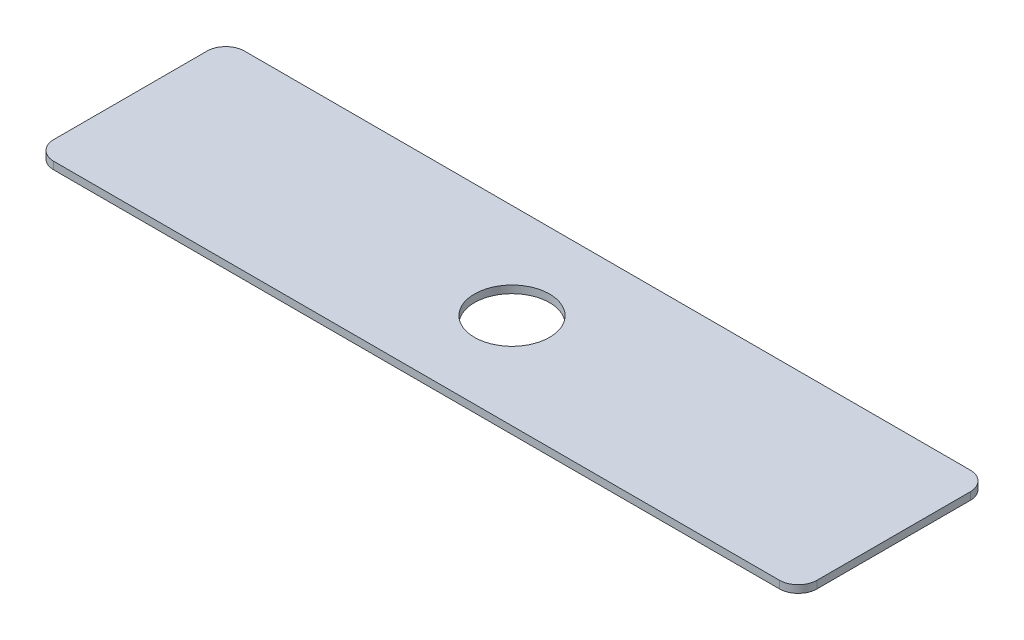
ISO-10303-21;
HEADER;
FILE_DESCRIPTION(('STEP AP214'),'2;1');
FILE_NAME('part.step','',(''),(''),'','','');
FILE_SCHEMA(('AUTOMOTIVE_DESIGN { 1 0 10303 214 1 1 1 1 }'));
ENDSEC;
DATA;
#1=APPLICATION_CONTEXT('core data for automotive mechanical design processes');
#2=APPLICATION_PROTOCOL_DEFINITION('international standard','automotive_design',2000,#1);
#3=PRODUCT_CONTEXT('',#1,'mechanical');
#4=PRODUCT('Part','Part','',(#3));
#5=PRODUCT_RELATED_PRODUCT_CATEGORY('part','',(#4));
#6=PRODUCT_DEFINITION_FORMATION('','',#4);
#7=PRODUCT_DEFINITION_CONTEXT('part definition',#1,'design');
#8=PRODUCT_DEFINITION('design','',#6,#7);
#9=PRODUCT_DEFINITION_SHAPE('','',#8);
#10=(LENGTH_UNIT() NAMED_UNIT(*) SI_UNIT(.MILLI.,.METRE.));
#11=(NAMED_UNIT(*) PLANE_ANGLE_UNIT() SI_UNIT($,.RADIAN.));
#12=(NAMED_UNIT(*) SI_UNIT($,.STERADIAN.) SOLID_ANGLE_UNIT());
#13=UNCERTAINTY_MEASURE_WITH_UNIT(LENGTH_MEASURE(1.E-05),#10,'distance_accuracy_value','');
#14=(GEOMETRIC_REPRESENTATION_CONTEXT(3) GLOBAL_UNCERTAINTY_ASSIGNED_CONTEXT((#13)) GLOBAL_UNIT_ASSIGNED_CONTEXT((#10,
#11,#12)) REPRESENTATION_CONTEXT('',''));
#15=CARTESIAN_POINT('',(0.,0.,0.));
#16=DIRECTION('',(0.,0.,1.));
#17=DIRECTION('',(1.,0.,0.));
#18=AXIS2_PLACEMENT_3D('',#15,#16,#17);
#19=CARTESIAN_POINT('',(101.6,1.,-25.4));
#20=DIRECTION('',(-1.,0.,0.));
#21=DIRECTION('',(0.,0.,1.));
#22=AXIS2_PLACEMENT_3D('',#19,#20,#21);
#23=PLANE('',#22);
#24=DIRECTION('',(0.,0.,-1.));
#25=VECTOR('',#24,1.);
#26=CARTESIAN_POINT('',(101.6,-1.,-25.4));
#27=LINE('',#26,#25);
#28=CARTESIAN_POINT('',(101.6,-1.,20.4));
#29=VERTEX_POINT('',#28);
#30=CARTESIAN_POINT('',(101.6,-1.,-20.4));
#31=VERTEX_POINT('',#30);
#32=EDGE_CURVE('E157',#29,#31,#27,.T.);
#33=ORIENTED_EDGE('',*,*,#32,.T.);
#34=DIRECTION('',(0.,-1.,0.));
#35=VECTOR('',#34,1.);
#36=CARTESIAN_POINT('',(101.6,1.,-20.4));
#37=LINE('',#36,#35);
#38=CARTESIAN_POINT('',(101.6,1.,-20.4));
#39=VERTEX_POINT('',#38);
#40=EDGE_CURVE('E11',#31,#39,#37,.F.);
#41=ORIENTED_EDGE('',*,*,#40,.T.);
#42=DIRECTION('',(0.,0.,-1.));
#43=VECTOR('',#42,1.);
#44=CARTESIAN_POINT('',(101.6,1.,-25.4));
#45=LINE('',#44,#43);
#46=CARTESIAN_POINT('',(101.6,1.,20.4));
#47=VERTEX_POINT('',#46);
#48=EDGE_CURVE('E125',#47,#39,#45,.T.);
#49=ORIENTED_EDGE('',*,*,#48,.F.);
#50=DIRECTION('',(0.,-1.,0.));
#51=VECTOR('',#50,1.);
#52=CARTESIAN_POINT('',(101.6,1.,20.4));
#53=LINE('',#52,#51);
#54=EDGE_CURVE('E41',#47,#29,#53,.T.);
#55=ORIENTED_EDGE('',*,*,#54,.T.);
#56=EDGE_LOOP('',(#33,#41,#49,#55));
#57=FACE_BOUND('',#56,.T.);
#58=ADVANCED_FACE('F33',(#57),#23,.F.);
#59=CARTESIAN_POINT('',(-101.6,1.,-25.4));
#60=DIRECTION('',(0.,0.,1.));
#61=DIRECTION('',(1.,0.,0.));
#62=AXIS2_PLACEMENT_3D('',#59,#60,#61);
#63=PLANE('',#62);
#64=DIRECTION('',(-1.,0.,0.));
#65=VECTOR('',#64,1.);
#66=CARTESIAN_POINT('',(-101.6,-1.,-25.4));
#67=LINE('',#66,#65);
#68=CARTESIAN_POINT('',(96.6,-1.,-25.4));
#69=VERTEX_POINT('',#68);
#70=CARTESIAN_POINT('',(-96.6,-1.,-25.4));
#71=VERTEX_POINT('',#70);
#72=EDGE_CURVE('E130',#69,#71,#67,.T.);
#73=ORIENTED_EDGE('',*,*,#72,.T.);
#74=DIRECTION('',(0.,-1.,0.));
#75=VECTOR('',#74,1.);
#76=CARTESIAN_POINT('',(-96.6,1.,-25.4));
#77=LINE('',#76,#75);
#78=CARTESIAN_POINT('',(-96.6,1.,-25.4));
#79=VERTEX_POINT('',#78);
#80=EDGE_CURVE('E48',#71,#79,#77,.F.);
#81=ORIENTED_EDGE('',*,*,#80,.T.);
#82=DIRECTION('',(-1.,0.,0.));
#83=VECTOR('',#82,1.);
#84=CARTESIAN_POINT('',(-101.6,1.,-25.4));
#85=LINE('',#84,#83);
#86=CARTESIAN_POINT('',(96.6,1.,-25.4));
#87=VERTEX_POINT('',#86);
#88=EDGE_CURVE('E128',#87,#79,#85,.T.);
#89=ORIENTED_EDGE('',*,*,#88,.F.);
#90=DIRECTION('',(0.,-1.,0.));
#91=VECTOR('',#90,1.);
#92=CARTESIAN_POINT('',(96.6,1.,-25.4));
#93=LINE('',#92,#91);
#94=EDGE_CURVE('E149',#87,#69,#93,.T.);
#95=ORIENTED_EDGE('',*,*,#94,.T.);
#96=EDGE_LOOP('',(#73,#81,#89,#95));
#97=FACE_BOUND('',#96,.T.);
#98=ADVANCED_FACE('F188',(#97),#63,.F.);
#99=CARTESIAN_POINT('',(-101.6,1.,-25.4));
#100=DIRECTION('',(1.,0.,0.));
#101=DIRECTION('',(0.,0.,-1.));
#102=AXIS2_PLACEMENT_3D('',#99,#100,#101);
#103=PLANE('',#102);
#104=DIRECTION('',(0.,0.,1.));
#105=VECTOR('',#104,1.);
#106=CARTESIAN_POINT('',(-101.6,-1.,-25.4));
#107=LINE('',#106,#105);
#108=CARTESIAN_POINT('',(-101.6,-1.,-20.4));
#109=VERTEX_POINT('',#108);
#110=CARTESIAN_POINT('',(-101.6,-1.,20.4));
#111=VERTEX_POINT('',#110);
#112=EDGE_CURVE('E126',#109,#111,#107,.T.);
#113=ORIENTED_EDGE('',*,*,#112,.T.);
#114=DIRECTION('',(0.,-1.,0.));
#115=VECTOR('',#114,1.);
#116=CARTESIAN_POINT('',(-101.6,1.,20.4));
#117=LINE('',#116,#115);
#118=CARTESIAN_POINT('',(-101.6,1.,20.4));
#119=VERTEX_POINT('',#118);
#120=EDGE_CURVE('E104',#111,#119,#117,.F.);
#121=ORIENTED_EDGE('',*,*,#120,.T.);
#122=DIRECTION('',(0.,0.,1.));
#123=VECTOR('',#122,1.);
#124=CARTESIAN_POINT('',(-101.6,1.,-25.4));
#125=LINE('',#124,#123);
#126=CARTESIAN_POINT('',(-101.6,1.,-20.4));
#127=VERTEX_POINT('',#126);
#128=EDGE_CURVE('E169',#127,#119,#125,.T.);
#129=ORIENTED_EDGE('',*,*,#128,.F.);
#130=DIRECTION('',(0.,-1.,0.));
#131=VECTOR('',#130,1.);
#132=CARTESIAN_POINT('',(-101.6,1.,-20.4));
#133=LINE('',#132,#131);
#134=EDGE_CURVE('E109',#127,#109,#133,.T.);
#135=ORIENTED_EDGE('',*,*,#134,.T.);
#136=EDGE_LOOP('',(#113,#121,#129,#135));
#137=FACE_BOUND('',#136,.T.);
#138=ADVANCED_FACE('F185',(#137),#103,.F.);
#139=CARTESIAN_POINT('',(-101.6,1.,25.4));
#140=DIRECTION('',(0.,0.,-1.));
#141=DIRECTION('',(-1.,0.,0.));
#142=AXIS2_PLACEMENT_3D('',#139,#140,#141);
#143=PLANE('',#142);
#144=DIRECTION('',(1.,0.,0.));
#145=VECTOR('',#144,1.);
#146=CARTESIAN_POINT('',(-101.6,1.,25.4));
#147=LINE('',#146,#145);
#148=CARTESIAN_POINT('',(-96.6,1.,25.4));
#149=VERTEX_POINT('',#148);
#150=CARTESIAN_POINT('',(96.6,1.,25.4));
#151=VERTEX_POINT('',#150);
#152=EDGE_CURVE('E119',#149,#151,#147,.T.);
#153=ORIENTED_EDGE('',*,*,#152,.F.);
#154=DIRECTION('',(0.,-1.,0.));
#155=VECTOR('',#154,1.);
#156=CARTESIAN_POINT('',(-96.6,1.,25.4));
#157=LINE('',#156,#155);
#158=CARTESIAN_POINT('',(-96.6,-1.,25.4));
#159=VERTEX_POINT('',#158);
#160=EDGE_CURVE('E103',#149,#159,#157,.T.);
#161=ORIENTED_EDGE('',*,*,#160,.T.);
#162=DIRECTION('',(1.,0.,0.));
#163=VECTOR('',#162,1.);
#164=CARTESIAN_POINT('',(-101.6,-1.,25.4));
#165=LINE('',#164,#163);
#166=CARTESIAN_POINT('',(96.6,-1.,25.4));
#167=VERTEX_POINT('',#166);
#168=EDGE_CURVE('E116',#159,#167,#165,.T.);
#169=ORIENTED_EDGE('',*,*,#168,.T.);
#170=DIRECTION('',(0.,-1.,0.));
#171=VECTOR('',#170,1.);
#172=CARTESIAN_POINT('',(96.6,1.,25.4));
#173=LINE('',#172,#171);
#174=EDGE_CURVE('E121',#167,#151,#173,.F.);
#175=ORIENTED_EDGE('',*,*,#174,.T.);
#176=EDGE_LOOP('',(#153,#161,#169,#175));
#177=FACE_BOUND('',#176,.T.);
#178=ADVANCED_FACE('F115',(#177),#143,.F.);
#179=CARTESIAN_POINT('',(0.,1.,0.));
#180=DIRECTION('',(0.,1.,0.));
#181=DIRECTION('',(0.,0.,1.));
#182=AXIS2_PLACEMENT_3D('',#179,#180,#181);
#183=PLANE('',#182);
#184=CARTESIAN_POINT('',(0.,1.,0.));
#185=DIRECTION('',(0.,1.,0.));
#186=DIRECTION('',(0.,0.,1.));
#187=AXIS2_PLACEMENT_3D('',#184,#185,#186);
#188=CIRCLE('',#187,10.);
#189=CARTESIAN_POINT('',(0.,1.,10.));
#190=VERTEX_POINT('',#189);
#191=EDGE_CURVE('E165',#190,#190,#188,.T.);
#192=ORIENTED_EDGE('',*,*,#191,.F.);
#193=EDGE_LOOP('',(#192));
#194=FACE_BOUND('',#193,.T.);
#195=ORIENTED_EDGE('',*,*,#128,.T.);
#196=CARTESIAN_POINT('',(-96.6,1.,20.4));
#197=DIRECTION('',(0.,1.,0.));
#198=DIRECTION('',(0.,0.,1.));
#199=AXIS2_PLACEMENT_3D('',#196,#197,#198);
#200=CIRCLE('',#199,5.);
#201=EDGE_CURVE('E147',#119,#149,#200,.T.);
#202=ORIENTED_EDGE('',*,*,#201,.T.);
#203=ORIENTED_EDGE('',*,*,#152,.T.);
#204=CARTESIAN_POINT('',(96.6,1.,20.4));
#205=DIRECTION('',(0.,1.,0.));
#206=DIRECTION('',(0.,0.,1.));
#207=AXIS2_PLACEMENT_3D('',#204,#205,#206);
#208=CIRCLE('',#207,5.);
#209=EDGE_CURVE('E142',#151,#47,#208,.T.);
#210=ORIENTED_EDGE('',*,*,#209,.T.);
#211=ORIENTED_EDGE('',*,*,#48,.T.);
#212=CARTESIAN_POINT('',(96.6,1.,-20.4));
#213=DIRECTION('',(0.,1.,0.));
#214=DIRECTION('',(0.,0.,1.));
#215=AXIS2_PLACEMENT_3D('',#212,#213,#214);
#216=CIRCLE('',#215,5.);
#217=EDGE_CURVE('E55',#39,#87,#216,.T.);
#218=ORIENTED_EDGE('',*,*,#217,.T.);
#219=ORIENTED_EDGE('',*,*,#88,.T.);
#220=CARTESIAN_POINT('',(-96.6,1.,-20.4));
#221=DIRECTION('',(0.,1.,0.));
#222=DIRECTION('',(0.,0.,1.));
#223=AXIS2_PLACEMENT_3D('',#220,#221,#222);
#224=CIRCLE('',#223,5.);
#225=EDGE_CURVE('E145',#79,#127,#224,.T.);
#226=ORIENTED_EDGE('',*,*,#225,.T.);
#227=EDGE_LOOP('',(#195,#202,#203,#210,#211,#218,#219,#226));
#228=FACE_BOUND('',#227,.T.);
#229=ADVANCED_FACE('F178',(#194,#228),#183,.T.);
#230=CARTESIAN_POINT('',(0.,-1.,0.));
#231=DIRECTION('',(0.,1.,0.));
#232=DIRECTION('',(0.,0.,1.));
#233=AXIS2_PLACEMENT_3D('',#230,#231,#232);
#234=PLANE('',#233);
#235=CARTESIAN_POINT('',(0.,-1.,0.));
#236=DIRECTION('',(0.,1.,0.));
#237=DIRECTION('',(0.,0.,1.));
#238=AXIS2_PLACEMENT_3D('',#235,#236,#237);
#239=CIRCLE('',#238,10.);
#240=CARTESIAN_POINT('',(0.,-1.,10.));
#241=VERTEX_POINT('',#240);
#242=EDGE_CURVE('E162',#241,#241,#239,.T.);
#243=ORIENTED_EDGE('',*,*,#242,.T.);
#244=EDGE_LOOP('',(#243));
#245=FACE_BOUND('',#244,.T.);
#246=ORIENTED_EDGE('',*,*,#168,.F.);
#247=CARTESIAN_POINT('',(-96.6,-1.,20.4));
#248=DIRECTION('',(0.,1.,0.));
#249=DIRECTION('',(0.,0.,1.));
#250=AXIS2_PLACEMENT_3D('',#247,#248,#249);
#251=CIRCLE('',#250,5.);
#252=EDGE_CURVE('E99',#159,#111,#251,.F.);
#253=ORIENTED_EDGE('',*,*,#252,.T.);
#254=ORIENTED_EDGE('',*,*,#112,.F.);
#255=CARTESIAN_POINT('',(-96.6,-1.,-20.4));
#256=DIRECTION('',(0.,1.,0.));
#257=DIRECTION('',(0.,0.,1.));
#258=AXIS2_PLACEMENT_3D('',#255,#256,#257);
#259=CIRCLE('',#258,5.);
#260=EDGE_CURVE('E110',#109,#71,#259,.F.);
#261=ORIENTED_EDGE('',*,*,#260,.T.);
#262=ORIENTED_EDGE('',*,*,#72,.F.);
#263=CARTESIAN_POINT('',(96.6,-1.,-20.4));
#264=DIRECTION('',(0.,1.,0.));
#265=DIRECTION('',(0.,0.,1.));
#266=AXIS2_PLACEMENT_3D('',#263,#264,#265);
#267=CIRCLE('',#266,5.);
#268=EDGE_CURVE('E136',#69,#31,#267,.F.);
#269=ORIENTED_EDGE('',*,*,#268,.T.);
#270=ORIENTED_EDGE('',*,*,#32,.F.);
#271=CARTESIAN_POINT('',(96.6,-1.,20.4));
#272=DIRECTION('',(0.,1.,0.));
#273=DIRECTION('',(0.,0.,1.));
#274=AXIS2_PLACEMENT_3D('',#271,#272,#273);
#275=CIRCLE('',#274,5.);
#276=EDGE_CURVE('E120',#29,#167,#275,.F.);
#277=ORIENTED_EDGE('',*,*,#276,.T.);
#278=EDGE_LOOP('',(#246,#253,#254,#261,#262,#269,#270,#277));
#279=FACE_BOUND('',#278,.T.);
#280=ADVANCED_FACE('F123',(#245,#279),#234,.F.);
#281=CARTESIAN_POINT('',(-96.6,1.,20.4));
#282=DIRECTION('',(0.,-1.,0.));
#283=DIRECTION('',(0.,0.,-1.));
#284=AXIS2_PLACEMENT_3D('',#281,#282,#283);
#285=CYLINDRICAL_SURFACE('',#284,5.);
#286=ORIENTED_EDGE('',*,*,#201,.F.);
#287=ORIENTED_EDGE('',*,*,#120,.F.);
#288=ORIENTED_EDGE('',*,*,#252,.F.);
#289=ORIENTED_EDGE('',*,*,#160,.F.);
#290=EDGE_LOOP('',(#286,#287,#288,#289));
#291=FACE_BOUND('',#290,.T.);
#292=ADVANCED_FACE('F102',(#291),#285,.T.);
#293=CARTESIAN_POINT('',(-96.6,1.,-20.4));
#294=DIRECTION('',(0.,-1.,0.));
#295=DIRECTION('',(0.,0.,-1.));
#296=AXIS2_PLACEMENT_3D('',#293,#294,#295);
#297=CYLINDRICAL_SURFACE('',#296,5.);
#298=ORIENTED_EDGE('',*,*,#225,.F.);
#299=ORIENTED_EDGE('',*,*,#80,.F.);
#300=ORIENTED_EDGE('',*,*,#260,.F.);
#301=ORIENTED_EDGE('',*,*,#134,.F.);
#302=EDGE_LOOP('',(#298,#299,#300,#301));
#303=FACE_BOUND('',#302,.T.);
#304=ADVANCED_FACE('F187',(#303),#297,.T.);
#305=CARTESIAN_POINT('',(96.6,1.,-20.4));
#306=DIRECTION('',(0.,-1.,0.));
#307=DIRECTION('',(0.,0.,-1.));
#308=AXIS2_PLACEMENT_3D('',#305,#306,#307);
#309=CYLINDRICAL_SURFACE('',#308,5.);
#310=ORIENTED_EDGE('',*,*,#217,.F.);
#311=ORIENTED_EDGE('',*,*,#40,.F.);
#312=ORIENTED_EDGE('',*,*,#268,.F.);
#313=ORIENTED_EDGE('',*,*,#94,.F.);
#314=EDGE_LOOP('',(#310,#311,#312,#313));
#315=FACE_BOUND('',#314,.T.);
#316=ADVANCED_FACE('F191',(#315),#309,.T.);
#317=CARTESIAN_POINT('',(96.6,1.,20.4));
#318=DIRECTION('',(0.,-1.,0.));
#319=DIRECTION('',(0.,0.,-1.));
#320=AXIS2_PLACEMENT_3D('',#317,#318,#319);
#321=CYLINDRICAL_SURFACE('',#320,5.);
#322=ORIENTED_EDGE('',*,*,#209,.F.);
#323=ORIENTED_EDGE('',*,*,#174,.F.);
#324=ORIENTED_EDGE('',*,*,#276,.F.);
#325=ORIENTED_EDGE('',*,*,#54,.F.);
#326=EDGE_LOOP('',(#322,#323,#324,#325));
#327=FACE_BOUND('',#326,.T.);
#328=ADVANCED_FACE('F35',(#327),#321,.T.);
#329=CARTESIAN_POINT('',(0.,-1.,0.));
#330=DIRECTION('',(0.,1.,0.));
#331=DIRECTION('',(0.,0.,1.));
#332=AXIS2_PLACEMENT_3D('',#329,#330,#331);
#333=CYLINDRICAL_SURFACE('',#332,10.);
#334=ORIENTED_EDGE('',*,*,#242,.F.);
#335=EDGE_LOOP('',(#334));
#336=FACE_BOUND('',#335,.T.);
#337=ORIENTED_EDGE('',*,*,#191,.T.);
#338=EDGE_LOOP('',(#337));
#339=FACE_BOUND('',#338,.T.);
#340=ADVANCED_FACE('F176',(#336,#339),#333,.F.);
#341=CLOSED_SHELL('',(#58,#98,#138,#178,#229,#280,#292,#304,#316,#328,#340));
#342=MANIFOLD_SOLID_BREP('B2',#341);
#343=ADVANCED_BREP_SHAPE_REPRESENTATION('',(#18,#342),#14);
#344=SHAPE_DEFINITION_REPRESENTATION(#9,#343);
ENDSEC;
END-ISO-10303-21;
